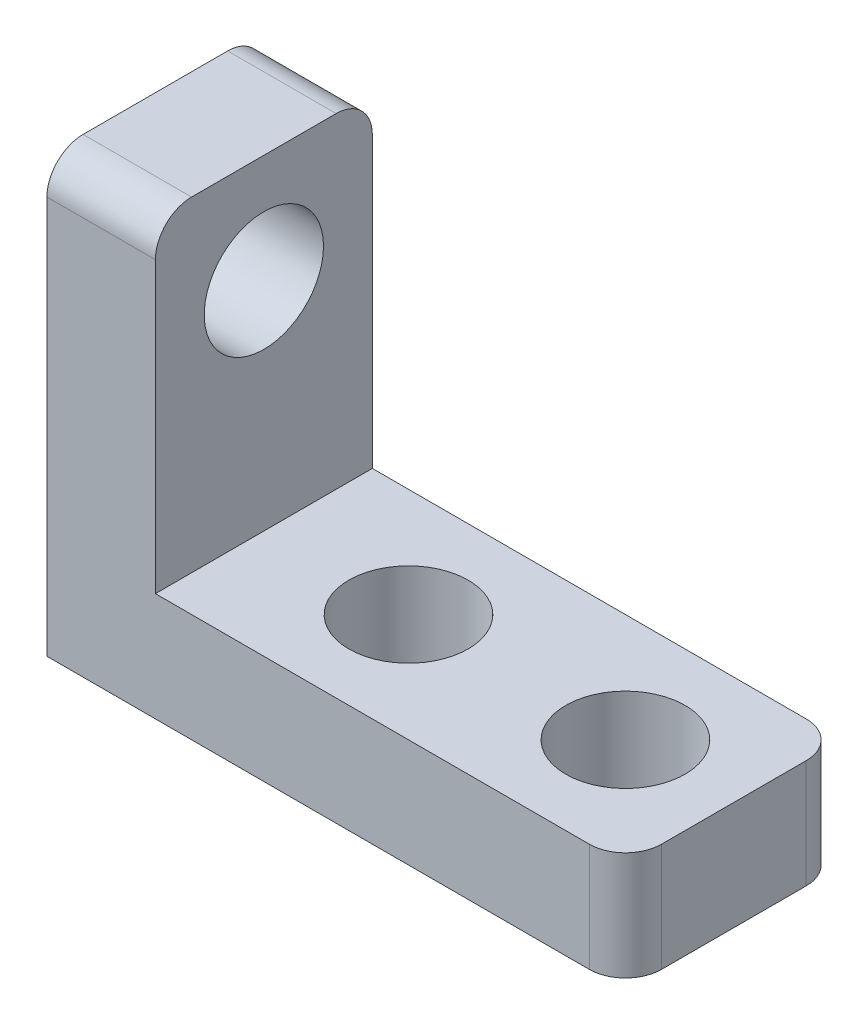
ISO-10303-21;
HEADER;
FILE_DESCRIPTION(('STEP AP214'),'2;1');
FILE_NAME('part.step','',(''),(''),'','','');
FILE_SCHEMA(('AUTOMOTIVE_DESIGN { 1 0 10303 214 1 1 1 1 }'));
ENDSEC;
DATA;
#1=APPLICATION_CONTEXT('core data for automotive mechanical design processes');
#2=APPLICATION_PROTOCOL_DEFINITION('international standard','automotive_design',2000,#1);
#3=PRODUCT_CONTEXT('',#1,'mechanical');
#4=PRODUCT('Part','Part','',(#3));
#5=PRODUCT_RELATED_PRODUCT_CATEGORY('part','',(#4));
#6=PRODUCT_DEFINITION_FORMATION('','',#4);
#7=PRODUCT_DEFINITION_CONTEXT('part definition',#1,'design');
#8=PRODUCT_DEFINITION('design','',#6,#7);
#9=PRODUCT_DEFINITION_SHAPE('','',#8);
#10=(LENGTH_UNIT() NAMED_UNIT(*) SI_UNIT(.MILLI.,.METRE.));
#11=(NAMED_UNIT(*) PLANE_ANGLE_UNIT() SI_UNIT($,.RADIAN.));
#12=(NAMED_UNIT(*) SI_UNIT($,.STERADIAN.) SOLID_ANGLE_UNIT());
#13=UNCERTAINTY_MEASURE_WITH_UNIT(LENGTH_MEASURE(1.E-05),#10,'distance_accuracy_value','');
#14=(GEOMETRIC_REPRESENTATION_CONTEXT(3) GLOBAL_UNCERTAINTY_ASSIGNED_CONTEXT((#13)) GLOBAL_UNIT_ASSIGNED_CONTEXT((#10,
#11,#12)) REPRESENTATION_CONTEXT('',''));
#15=CARTESIAN_POINT('',(0.,0.,0.));
#16=DIRECTION('',(0.,0.,1.));
#17=DIRECTION('',(1.,0.,0.));
#18=AXIS2_PLACEMENT_3D('',#15,#16,#17);
#19=CARTESIAN_POINT('',(0.,0.,6.));
#20=DIRECTION('',(1.,0.,0.));
#21=DIRECTION('',(0.,0.,-1.));
#22=AXIS2_PLACEMENT_3D('',#19,#20,#21);
#23=PLANE('',#22);
#24=CARTESIAN_POINT('',(0.,9.,3.));
#25=DIRECTION('',(1.,0.,0.));
#26=DIRECTION('',(0.,0.,-1.));
#27=AXIS2_PLACEMENT_3D('',#24,#25,#26);
#28=CIRCLE('',#27,1.65);
#29=CARTESIAN_POINT('',(0.,9.,1.35));
#30=VERTEX_POINT('',#29);
#31=EDGE_CURVE('E195',#30,#30,#28,.T.);
#32=ORIENTED_EDGE('',*,*,#31,.T.);
#33=EDGE_LOOP('',(#32));
#34=FACE_BOUND('',#33,.T.);
#35=DIRECTION('',(0.,-1.,0.));
#36=VECTOR('',#35,1.);
#37=CARTESIAN_POINT('',(0.,0.,6.));
#38=LINE('',#37,#36);
#39=CARTESIAN_POINT('',(0.,11.,6.));
#40=VERTEX_POINT('',#39);
#41=CARTESIAN_POINT('',(0.,0.,6.));
#42=VERTEX_POINT('',#41);
#43=EDGE_CURVE('E112',#40,#42,#38,.T.);
#44=ORIENTED_EDGE('',*,*,#43,.F.);
#45=CARTESIAN_POINT('',(0.,11.,5.));
#46=DIRECTION('',(1.,0.,0.));
#47=DIRECTION('',(0.,0.,-1.));
#48=AXIS2_PLACEMENT_3D('',#45,#46,#47);
#49=CIRCLE('',#48,1.);
#50=CARTESIAN_POINT('',(0.,12.,5.));
#51=VERTEX_POINT('',#50);
#52=EDGE_CURVE('E145',#40,#51,#49,.F.);
#53=ORIENTED_EDGE('',*,*,#52,.T.);
#54=DIRECTION('',(0.,0.,-1.));
#55=VECTOR('',#54,1.);
#56=CARTESIAN_POINT('',(0.,12.,6.));
#57=LINE('',#56,#55);
#58=CARTESIAN_POINT('',(0.,12.,1.));
#59=VERTEX_POINT('',#58);
#60=EDGE_CURVE('E191',#51,#59,#57,.T.);
#61=ORIENTED_EDGE('',*,*,#60,.T.);
#62=CARTESIAN_POINT('',(0.,11.,1.));
#63=DIRECTION('',(1.,0.,0.));
#64=DIRECTION('',(0.,0.,-1.));
#65=AXIS2_PLACEMENT_3D('',#62,#63,#64);
#66=CIRCLE('',#65,1.);
#67=CARTESIAN_POINT('',(0.,11.,0.));
#68=VERTEX_POINT('',#67);
#69=EDGE_CURVE('E143',#59,#68,#66,.F.);
#70=ORIENTED_EDGE('',*,*,#69,.T.);
#71=DIRECTION('',(0.,-1.,0.));
#72=VECTOR('',#71,1.);
#73=CARTESIAN_POINT('',(0.,0.,0.));
#74=LINE('',#73,#72);
#75=CARTESIAN_POINT('',(0.,0.,0.));
#76=VERTEX_POINT('',#75);
#77=EDGE_CURVE('E132',#68,#76,#74,.T.);
#78=ORIENTED_EDGE('',*,*,#77,.T.);
#79=DIRECTION('',(0.,0.,-1.));
#80=VECTOR('',#79,1.);
#81=CARTESIAN_POINT('',(0.,0.,6.));
#82=LINE('',#81,#80);
#83=EDGE_CURVE('E127',#42,#76,#82,.T.);
#84=ORIENTED_EDGE('',*,*,#83,.F.);
#85=EDGE_LOOP('',(#44,#53,#61,#70,#78,#84));
#86=FACE_BOUND('',#85,.T.);
#87=ADVANCED_FACE('F34',(#34,#86),#23,.F.);
#88=CARTESIAN_POINT('',(0.,0.,6.));
#89=DIRECTION('',(0.,1.,0.));
#90=DIRECTION('',(0.,0.,1.));
#91=AXIS2_PLACEMENT_3D('',#88,#89,#90);
#92=PLANE('',#91);
#93=CARTESIAN_POINT('',(7.,0.,3.));
#94=DIRECTION('',(0.,1.,0.));
#95=DIRECTION('',(0.,0.,1.));
#96=AXIS2_PLACEMENT_3D('',#93,#94,#95);
#97=CIRCLE('',#96,1.65);
#98=CARTESIAN_POINT('',(7.,0.,4.65));
#99=VERTEX_POINT('',#98);
#100=EDGE_CURVE('E268',#99,#99,#97,.T.);
#101=ORIENTED_EDGE('',*,*,#100,.T.);
#102=EDGE_LOOP('',(#101));
#103=FACE_BOUND('',#102,.T.);
#104=CARTESIAN_POINT('',(13.,0.,3.));
#105=DIRECTION('',(0.,1.,0.));
#106=DIRECTION('',(0.,0.,1.));
#107=AXIS2_PLACEMENT_3D('',#104,#105,#106);
#108=CIRCLE('',#107,1.65);
#109=CARTESIAN_POINT('',(13.,0.,4.65));
#110=VERTEX_POINT('',#109);
#111=EDGE_CURVE('E270',#110,#110,#108,.T.);
#112=ORIENTED_EDGE('',*,*,#111,.T.);
#113=EDGE_LOOP('',(#112));
#114=FACE_BOUND('',#113,.T.);
#115=DIRECTION('',(1.,0.,0.));
#116=VECTOR('',#115,1.);
#117=CARTESIAN_POINT('',(0.,0.,0.));
#118=LINE('',#117,#116);
#119=CARTESIAN_POINT('',(15.,0.,0.));
#120=VERTEX_POINT('',#119);
#121=EDGE_CURVE('E181',#76,#120,#118,.T.);
#122=ORIENTED_EDGE('',*,*,#121,.T.);
#123=CARTESIAN_POINT('',(15.,0.,1.));
#124=DIRECTION('',(0.,1.,0.));
#125=DIRECTION('',(0.,0.,1.));
#126=AXIS2_PLACEMENT_3D('',#123,#124,#125);
#127=CIRCLE('',#126,1.);
#128=CARTESIAN_POINT('',(16.,0.,1.));
#129=VERTEX_POINT('',#128);
#130=EDGE_CURVE('E11',#120,#129,#127,.F.);
#131=ORIENTED_EDGE('',*,*,#130,.T.);
#132=DIRECTION('',(0.,0.,-1.));
#133=VECTOR('',#132,1.);
#134=CARTESIAN_POINT('',(16.,0.,6.));
#135=LINE('',#134,#133);
#136=CARTESIAN_POINT('',(16.,0.,5.));
#137=VERTEX_POINT('',#136);
#138=EDGE_CURVE('E135',#137,#129,#135,.T.);
#139=ORIENTED_EDGE('',*,*,#138,.F.);
#140=CARTESIAN_POINT('',(15.,0.,5.));
#141=DIRECTION('',(0.,1.,0.));
#142=DIRECTION('',(0.,0.,1.));
#143=AXIS2_PLACEMENT_3D('',#140,#141,#142);
#144=CIRCLE('',#143,1.);
#145=CARTESIAN_POINT('',(15.,0.,6.));
#146=VERTEX_POINT('',#145);
#147=EDGE_CURVE('E42',#137,#146,#144,.F.);
#148=ORIENTED_EDGE('',*,*,#147,.T.);
#149=DIRECTION('',(1.,0.,0.));
#150=VECTOR('',#149,1.);
#151=CARTESIAN_POINT('',(0.,0.,6.));
#152=LINE('',#151,#150);
#153=EDGE_CURVE('E117',#42,#146,#152,.T.);
#154=ORIENTED_EDGE('',*,*,#153,.F.);
#155=ORIENTED_EDGE('',*,*,#83,.T.);
#156=EDGE_LOOP('',(#122,#131,#139,#148,#154,#155));
#157=FACE_BOUND('',#156,.T.);
#158=ADVANCED_FACE('F126',(#103,#114,#157),#92,.F.);
#159=CARTESIAN_POINT('',(16.,3.,6.));
#160=DIRECTION('',(-1.,0.,0.));
#161=DIRECTION('',(0.,0.,1.));
#162=AXIS2_PLACEMENT_3D('',#159,#160,#161);
#163=PLANE('',#162);
#164=ORIENTED_EDGE('',*,*,#138,.T.);
#165=DIRECTION('',(0.,1.,0.));
#166=VECTOR('',#165,1.);
#167=CARTESIAN_POINT('',(16.,3.,1.));
#168=LINE('',#167,#166);
#169=CARTESIAN_POINT('',(16.,3.,1.));
#170=VERTEX_POINT('',#169);
#171=EDGE_CURVE('E161',#129,#170,#168,.T.);
#172=ORIENTED_EDGE('',*,*,#171,.T.);
#173=DIRECTION('',(0.,0.,-1.));
#174=VECTOR('',#173,1.);
#175=CARTESIAN_POINT('',(16.,3.,6.));
#176=LINE('',#175,#174);
#177=CARTESIAN_POINT('',(16.,3.,5.));
#178=VERTEX_POINT('',#177);
#179=EDGE_CURVE('E138',#178,#170,#176,.T.);
#180=ORIENTED_EDGE('',*,*,#179,.F.);
#181=DIRECTION('',(0.,1.,0.));
#182=VECTOR('',#181,1.);
#183=CARTESIAN_POINT('',(16.,3.,5.));
#184=LINE('',#183,#182);
#185=EDGE_CURVE('E54',#178,#137,#184,.F.);
#186=ORIENTED_EDGE('',*,*,#185,.T.);
#187=EDGE_LOOP('',(#164,#172,#180,#186));
#188=FACE_BOUND('',#187,.T.);
#189=ADVANCED_FACE('F184',(#188),#163,.F.);
#190=CARTESIAN_POINT('',(3.,3.,6.));
#191=DIRECTION('',(0.,-1.,0.));
#192=DIRECTION('',(0.,0.,-1.));
#193=AXIS2_PLACEMENT_3D('',#190,#191,#192);
#194=PLANE('',#193);
#195=CARTESIAN_POINT('',(7.,3.,3.));
#196=DIRECTION('',(0.,1.,0.));
#197=DIRECTION('',(0.,0.,1.));
#198=AXIS2_PLACEMENT_3D('',#195,#196,#197);
#199=CIRCLE('',#198,1.65);
#200=CARTESIAN_POINT('',(7.,3.,4.65));
#201=VERTEX_POINT('',#200);
#202=EDGE_CURVE('E265',#201,#201,#199,.T.);
#203=ORIENTED_EDGE('',*,*,#202,.F.);
#204=EDGE_LOOP('',(#203));
#205=FACE_BOUND('',#204,.T.);
#206=CARTESIAN_POINT('',(13.,3.,3.));
#207=DIRECTION('',(0.,1.,0.));
#208=DIRECTION('',(0.,0.,1.));
#209=AXIS2_PLACEMENT_3D('',#206,#207,#208);
#210=CIRCLE('',#209,1.65);
#211=CARTESIAN_POINT('',(13.,3.,4.65));
#212=VERTEX_POINT('',#211);
#213=EDGE_CURVE('E280',#212,#212,#210,.T.);
#214=ORIENTED_EDGE('',*,*,#213,.F.);
#215=EDGE_LOOP('',(#214));
#216=FACE_BOUND('',#215,.T.);
#217=ORIENTED_EDGE('',*,*,#179,.T.);
#218=CARTESIAN_POINT('',(15.,3.,1.));
#219=DIRECTION('',(0.,-1.,0.));
#220=DIRECTION('',(0.,0.,-1.));
#221=AXIS2_PLACEMENT_3D('',#218,#219,#220);
#222=CIRCLE('',#221,1.);
#223=CARTESIAN_POINT('',(15.,3.,0.));
#224=VERTEX_POINT('',#223);
#225=EDGE_CURVE('E166',#170,#224,#222,.F.);
#226=ORIENTED_EDGE('',*,*,#225,.T.);
#227=DIRECTION('',(-1.,0.,0.));
#228=VECTOR('',#227,1.);
#229=CARTESIAN_POINT('',(3.,3.,0.));
#230=LINE('',#229,#228);
#231=CARTESIAN_POINT('',(3.,3.,0.));
#232=VERTEX_POINT('',#231);
#233=EDGE_CURVE('E172',#224,#232,#230,.T.);
#234=ORIENTED_EDGE('',*,*,#233,.T.);
#235=DIRECTION('',(0.,0.,-1.));
#236=VECTOR('',#235,1.);
#237=CARTESIAN_POINT('',(3.,3.,6.));
#238=LINE('',#237,#236);
#239=CARTESIAN_POINT('',(3.,3.,6.));
#240=VERTEX_POINT('',#239);
#241=EDGE_CURVE('E187',#240,#232,#238,.T.);
#242=ORIENTED_EDGE('',*,*,#241,.F.);
#243=DIRECTION('',(-1.,0.,0.));
#244=VECTOR('',#243,1.);
#245=CARTESIAN_POINT('',(3.,3.,6.));
#246=LINE('',#245,#244);
#247=CARTESIAN_POINT('',(15.,3.,6.));
#248=VERTEX_POINT('',#247);
#249=EDGE_CURVE('E129',#248,#240,#246,.T.);
#250=ORIENTED_EDGE('',*,*,#249,.F.);
#251=CARTESIAN_POINT('',(15.,3.,5.));
#252=DIRECTION('',(0.,-1.,0.));
#253=DIRECTION('',(0.,0.,-1.));
#254=AXIS2_PLACEMENT_3D('',#251,#252,#253);
#255=CIRCLE('',#254,1.);
#256=EDGE_CURVE('E164',#248,#178,#255,.F.);
#257=ORIENTED_EDGE('',*,*,#256,.T.);
#258=EDGE_LOOP('',(#217,#226,#234,#242,#250,#257));
#259=FACE_BOUND('',#258,.T.);
#260=ADVANCED_FACE('F170',(#205,#216,#259),#194,.F.);
#261=CARTESIAN_POINT('',(3.,12.,6.));
#262=DIRECTION('',(-1.,0.,0.));
#263=DIRECTION('',(0.,-1.,0.));
#264=AXIS2_PLACEMENT_3D('',#261,#262,#263);
#265=PLANE('',#264);
#266=CARTESIAN_POINT('',(3.,9.,3.));
#267=DIRECTION('',(1.,0.,0.));
#268=DIRECTION('',(0.,0.,-1.));
#269=AXIS2_PLACEMENT_3D('',#266,#267,#268);
#270=CIRCLE('',#269,1.65);
#271=CARTESIAN_POINT('',(3.,9.,1.35));
#272=VERTEX_POINT('',#271);
#273=EDGE_CURVE('E269',#272,#272,#270,.T.);
#274=ORIENTED_EDGE('',*,*,#273,.F.);
#275=EDGE_LOOP('',(#274));
#276=FACE_BOUND('',#275,.T.);
#277=DIRECTION('',(0.,0.,-1.));
#278=VECTOR('',#277,1.);
#279=CARTESIAN_POINT('',(3.,12.,6.));
#280=LINE('',#279,#278);
#281=CARTESIAN_POINT('',(3.,12.,5.));
#282=VERTEX_POINT('',#281);
#283=CARTESIAN_POINT('',(3.,12.,1.));
#284=VERTEX_POINT('',#283);
#285=EDGE_CURVE('E200',#282,#284,#280,.T.);
#286=ORIENTED_EDGE('',*,*,#285,.F.);
#287=CARTESIAN_POINT('',(3.,11.,5.));
#288=DIRECTION('',(-1.,0.,0.));
#289=DIRECTION('',(0.,-1.,0.));
#290=AXIS2_PLACEMENT_3D('',#287,#288,#289);
#291=CIRCLE('',#290,1.);
#292=CARTESIAN_POINT('',(3.,11.,6.));
#293=VERTEX_POINT('',#292);
#294=EDGE_CURVE('E154',#282,#293,#291,.F.);
#295=ORIENTED_EDGE('',*,*,#294,.T.);
#296=DIRECTION('',(0.,1.,0.));
#297=VECTOR('',#296,1.);
#298=CARTESIAN_POINT('',(3.,12.,6.));
#299=LINE('',#298,#297);
#300=EDGE_CURVE('E189',#240,#293,#299,.T.);
#301=ORIENTED_EDGE('',*,*,#300,.F.);
#302=ORIENTED_EDGE('',*,*,#241,.T.);
#303=DIRECTION('',(0.,1.,0.));
#304=VECTOR('',#303,1.);
#305=CARTESIAN_POINT('',(3.,12.,0.));
#306=LINE('',#305,#304);
#307=CARTESIAN_POINT('',(3.,11.,0.));
#308=VERTEX_POINT('',#307);
#309=EDGE_CURVE('E123',#232,#308,#306,.T.);
#310=ORIENTED_EDGE('',*,*,#309,.T.);
#311=CARTESIAN_POINT('',(3.,11.,1.));
#312=DIRECTION('',(-1.,0.,0.));
#313=DIRECTION('',(0.,-1.,0.));
#314=AXIS2_PLACEMENT_3D('',#311,#312,#313);
#315=CIRCLE('',#314,1.);
#316=EDGE_CURVE('E152',#308,#284,#315,.F.);
#317=ORIENTED_EDGE('',*,*,#316,.T.);
#318=EDGE_LOOP('',(#286,#295,#301,#302,#310,#317));
#319=FACE_BOUND('',#318,.T.);
#320=ADVANCED_FACE('F205',(#276,#319),#265,.F.);
#321=CARTESIAN_POINT('',(0.,12.,6.));
#322=DIRECTION('',(0.,-1.,0.));
#323=DIRECTION('',(0.,0.,-1.));
#324=AXIS2_PLACEMENT_3D('',#321,#322,#323);
#325=PLANE('',#324);
#326=ORIENTED_EDGE('',*,*,#60,.F.);
#327=DIRECTION('',(-1.,0.,0.));
#328=VECTOR('',#327,1.);
#329=CARTESIAN_POINT('',(0.,12.,5.));
#330=LINE('',#329,#328);
#331=EDGE_CURVE('E150',#51,#282,#330,.F.);
#332=ORIENTED_EDGE('',*,*,#331,.T.);
#333=ORIENTED_EDGE('',*,*,#285,.T.);
#334=DIRECTION('',(-1.,0.,0.));
#335=VECTOR('',#334,1.);
#336=CARTESIAN_POINT('',(0.,12.,1.));
#337=LINE('',#336,#335);
#338=EDGE_CURVE('E147',#284,#59,#337,.T.);
#339=ORIENTED_EDGE('',*,*,#338,.T.);
#340=EDGE_LOOP('',(#326,#332,#333,#339));
#341=FACE_BOUND('',#340,.T.);
#342=ADVANCED_FACE('F213',(#341),#325,.F.);
#343=CARTESIAN_POINT('',(0.,0.,6.));
#344=DIRECTION('',(0.,0.,-1.));
#345=DIRECTION('',(-1.,0.,0.));
#346=AXIS2_PLACEMENT_3D('',#343,#344,#345);
#347=PLANE('',#346);
#348=ORIENTED_EDGE('',*,*,#300,.T.);
#349=DIRECTION('',(-1.,0.,0.));
#350=VECTOR('',#349,1.);
#351=CARTESIAN_POINT('',(0.,11.,6.));
#352=LINE('',#351,#350);
#353=EDGE_CURVE('E120',#293,#40,#352,.T.);
#354=ORIENTED_EDGE('',*,*,#353,.T.);
#355=ORIENTED_EDGE('',*,*,#43,.T.);
#356=ORIENTED_EDGE('',*,*,#153,.T.);
#357=DIRECTION('',(0.,1.,0.));
#358=VECTOR('',#357,1.);
#359=CARTESIAN_POINT('',(15.,0.,6.));
#360=LINE('',#359,#358);
#361=EDGE_CURVE('E134',#146,#248,#360,.T.);
#362=ORIENTED_EDGE('',*,*,#361,.T.);
#363=ORIENTED_EDGE('',*,*,#249,.T.);
#364=EDGE_LOOP('',(#348,#354,#355,#356,#362,#363));
#365=FACE_BOUND('',#364,.T.);
#366=ADVANCED_FACE('F115',(#365),#347,.F.);
#367=CARTESIAN_POINT('',(0.,0.,0.));
#368=DIRECTION('',(0.,0.,-1.));
#369=DIRECTION('',(-1.,0.,0.));
#370=AXIS2_PLACEMENT_3D('',#367,#368,#369);
#371=PLANE('',#370);
#372=ORIENTED_EDGE('',*,*,#77,.F.);
#373=DIRECTION('',(-1.,0.,0.));
#374=VECTOR('',#373,1.);
#375=CARTESIAN_POINT('',(3.,11.,0.));
#376=LINE('',#375,#374);
#377=EDGE_CURVE('E158',#68,#308,#376,.F.);
#378=ORIENTED_EDGE('',*,*,#377,.T.);
#379=ORIENTED_EDGE('',*,*,#309,.F.);
#380=ORIENTED_EDGE('',*,*,#233,.F.);
#381=DIRECTION('',(0.,1.,0.));
#382=VECTOR('',#381,1.);
#383=CARTESIAN_POINT('',(15.,0.,0.));
#384=LINE('',#383,#382);
#385=EDGE_CURVE('E156',#224,#120,#384,.F.);
#386=ORIENTED_EDGE('',*,*,#385,.T.);
#387=ORIENTED_EDGE('',*,*,#121,.F.);
#388=EDGE_LOOP('',(#372,#378,#379,#380,#386,#387));
#389=FACE_BOUND('',#388,.T.);
#390=ADVANCED_FACE('F179',(#389),#371,.T.);
#391=CARTESIAN_POINT('',(-3.,9.,3.));
#392=DIRECTION('',(1.,0.,0.));
#393=DIRECTION('',(0.,0.,-1.));
#394=AXIS2_PLACEMENT_3D('',#391,#392,#393);
#395=CYLINDRICAL_SURFACE('',#394,1.65);
#396=ORIENTED_EDGE('',*,*,#273,.T.);
#397=EDGE_LOOP('',(#396));
#398=FACE_BOUND('',#397,.T.);
#399=ORIENTED_EDGE('',*,*,#31,.F.);
#400=EDGE_LOOP('',(#399));
#401=FACE_BOUND('',#400,.T.);
#402=ADVANCED_FACE('F248',(#398,#401),#395,.F.);
#403=CARTESIAN_POINT('',(13.,-3.,3.));
#404=DIRECTION('',(0.,1.,0.));
#405=DIRECTION('',(0.,0.,1.));
#406=AXIS2_PLACEMENT_3D('',#403,#404,#405);
#407=CYLINDRICAL_SURFACE('',#406,1.65);
#408=ORIENTED_EDGE('',*,*,#213,.T.);
#409=EDGE_LOOP('',(#408));
#410=FACE_BOUND('',#409,.T.);
#411=ORIENTED_EDGE('',*,*,#111,.F.);
#412=EDGE_LOOP('',(#411));
#413=FACE_BOUND('',#412,.T.);
#414=ADVANCED_FACE('F253',(#410,#413),#407,.F.);
#415=CARTESIAN_POINT('',(7.,-3.,3.));
#416=DIRECTION('',(0.,1.,0.));
#417=DIRECTION('',(0.,0.,1.));
#418=AXIS2_PLACEMENT_3D('',#415,#416,#417);
#419=CYLINDRICAL_SURFACE('',#418,1.65);
#420=ORIENTED_EDGE('',*,*,#202,.T.);
#421=EDGE_LOOP('',(#420));
#422=FACE_BOUND('',#421,.T.);
#423=ORIENTED_EDGE('',*,*,#100,.F.);
#424=EDGE_LOOP('',(#423));
#425=FACE_BOUND('',#424,.T.);
#426=ADVANCED_FACE('F224',(#422,#425),#419,.F.);
#427=CARTESIAN_POINT('',(0.,11.,5.));
#428=DIRECTION('',(-1.,0.,0.));
#429=DIRECTION('',(0.,0.,1.));
#430=AXIS2_PLACEMENT_3D('',#427,#428,#429);
#431=CYLINDRICAL_SURFACE('',#430,1.);
#432=ORIENTED_EDGE('',*,*,#294,.F.);
#433=ORIENTED_EDGE('',*,*,#331,.F.);
#434=ORIENTED_EDGE('',*,*,#52,.F.);
#435=ORIENTED_EDGE('',*,*,#353,.F.);
#436=EDGE_LOOP('',(#432,#433,#434,#435));
#437=FACE_BOUND('',#436,.T.);
#438=ADVANCED_FACE('F209',(#437),#431,.T.);
#439=CARTESIAN_POINT('',(0.,11.,1.));
#440=DIRECTION('',(1.,0.,0.));
#441=DIRECTION('',(0.,0.,-1.));
#442=AXIS2_PLACEMENT_3D('',#439,#440,#441);
#443=CYLINDRICAL_SURFACE('',#442,1.);
#444=ORIENTED_EDGE('',*,*,#316,.F.);
#445=ORIENTED_EDGE('',*,*,#377,.F.);
#446=ORIENTED_EDGE('',*,*,#69,.F.);
#447=ORIENTED_EDGE('',*,*,#338,.F.);
#448=EDGE_LOOP('',(#444,#445,#446,#447));
#449=FACE_BOUND('',#448,.T.);
#450=ADVANCED_FACE('F216',(#449),#443,.T.);
#451=CARTESIAN_POINT('',(15.,3.,1.));
#452=DIRECTION('',(0.,-1.,0.));
#453=DIRECTION('',(0.,0.,-1.));
#454=AXIS2_PLACEMENT_3D('',#451,#452,#453);
#455=CYLINDRICAL_SURFACE('',#454,1.);
#456=ORIENTED_EDGE('',*,*,#130,.F.);
#457=ORIENTED_EDGE('',*,*,#385,.F.);
#458=ORIENTED_EDGE('',*,*,#225,.F.);
#459=ORIENTED_EDGE('',*,*,#171,.F.);
#460=EDGE_LOOP('',(#456,#457,#458,#459));
#461=FACE_BOUND('',#460,.T.);
#462=ADVANCED_FACE('F183',(#461),#455,.T.);
#463=CARTESIAN_POINT('',(15.,0.,5.));
#464=DIRECTION('',(0.,1.,0.));
#465=DIRECTION('',(0.,0.,1.));
#466=AXIS2_PLACEMENT_3D('',#463,#464,#465);
#467=CYLINDRICAL_SURFACE('',#466,1.);
#468=ORIENTED_EDGE('',*,*,#147,.F.);
#469=ORIENTED_EDGE('',*,*,#185,.F.);
#470=ORIENTED_EDGE('',*,*,#256,.F.);
#471=ORIENTED_EDGE('',*,*,#361,.F.);
#472=EDGE_LOOP('',(#468,#469,#470,#471));
#473=FACE_BOUND('',#472,.T.);
#474=ADVANCED_FACE('F36',(#473),#467,.T.);
#475=CLOSED_SHELL('',(#87,#158,#189,#260,#320,#342,#366,#390,#402,#414,#426,#438,#450,#462,#474));
#476=MANIFOLD_SOLID_BREP('B2',#475);
#477=ADVANCED_BREP_SHAPE_REPRESENTATION('',(#18,#476),#14);
#478=SHAPE_DEFINITION_REPRESENTATION(#9,#477);
ENDSEC;
END-ISO-10303-21;
